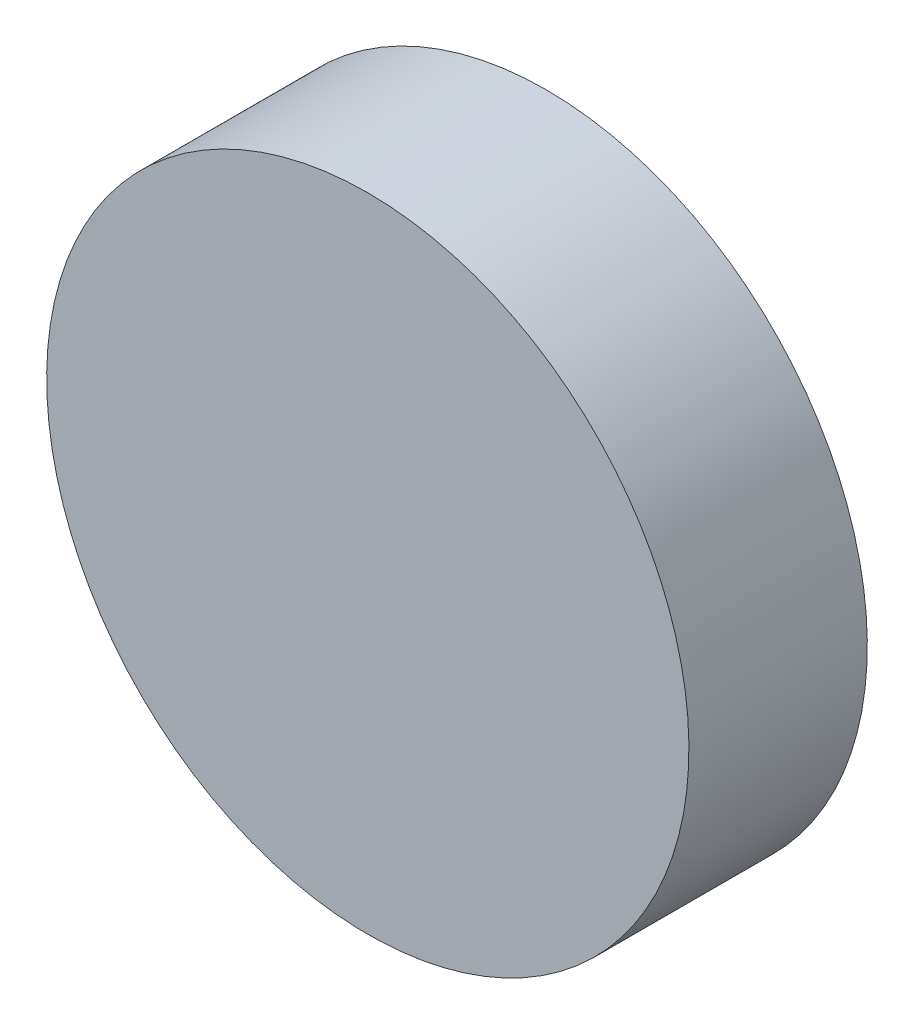
ISO-10303-21;
HEADER;
FILE_DESCRIPTION(('STEP AP214'),'2;1');
FILE_NAME('part.step','',(''),(''),'','','');
FILE_SCHEMA(('AUTOMOTIVE_DESIGN { 1 0 10303 214 1 1 1 1 }'));
ENDSEC;
DATA;
#1=APPLICATION_CONTEXT('core data for automotive mechanical design processes');
#2=APPLICATION_PROTOCOL_DEFINITION('international standard','automotive_design',2000,#1);
#3=PRODUCT_CONTEXT('',#1,'mechanical');
#4=PRODUCT('Part','Part','',(#3));
#5=PRODUCT_RELATED_PRODUCT_CATEGORY('part','',(#4));
#6=PRODUCT_DEFINITION_FORMATION('','',#4);
#7=PRODUCT_DEFINITION_CONTEXT('part definition',#1,'design');
#8=PRODUCT_DEFINITION('design','',#6,#7);
#9=PRODUCT_DEFINITION_SHAPE('','',#8);
#10=(LENGTH_UNIT() NAMED_UNIT(*) SI_UNIT(.MILLI.,.METRE.));
#11=(NAMED_UNIT(*) PLANE_ANGLE_UNIT() SI_UNIT($,.RADIAN.));
#12=(NAMED_UNIT(*) SI_UNIT($,.STERADIAN.) SOLID_ANGLE_UNIT());
#13=UNCERTAINTY_MEASURE_WITH_UNIT(LENGTH_MEASURE(1.E-05),#10,'distance_accuracy_value','');
#14=(GEOMETRIC_REPRESENTATION_CONTEXT(3) GLOBAL_UNCERTAINTY_ASSIGNED_CONTEXT((#13)) GLOBAL_UNIT_ASSIGNED_CONTEXT((#10,
#11,#12)) REPRESENTATION_CONTEXT('',''));
#15=CARTESIAN_POINT('',(0.,0.,0.));
#16=DIRECTION('',(0.,0.,1.));
#17=DIRECTION('',(1.,0.,0.));
#18=AXIS2_PLACEMENT_3D('',#15,#16,#17);
#19=CARTESIAN_POINT('',(23.8721990900897,21.3631677147825,-0.253998923289316));
#20=DIRECTION('',(0.,-8.74227339409095E-08,1.));
#21=DIRECTION('',(-1.19248806384999E-08,-1.,-8.74227339409095E-08));
#22=AXIS2_PLACEMENT_3D('',#19,#20,#21);
#23=PLANE('',#22);
#24=CARTESIAN_POINT('',(23.8721990846376,20.9059677147826,-0.253998963258991));
#25=DIRECTION('',(0.,8.74227339409095E-08,-1.));
#26=DIRECTION('',(1.19248806384999E-08,1.,8.74227339409095E-08));
#27=AXIS2_PLACEMENT_3D('',#24,#25,#26);
#28=CIRCLE('',#27,0.4572);
#29=CARTESIAN_POINT('',(23.8721990900897,21.3631677147826,-0.253998923289317));
#30=VERTEX_POINT('',#29);
#31=EDGE_CURVE('E10',#30,#30,#28,.T.);
#32=ORIENTED_EDGE('',*,*,#31,.T.);
#33=EDGE_LOOP('',(#32));
#34=FACE_BOUND('',#33,.T.);
#35=ADVANCED_FACE('F15',(#34),#23,.F.);
#36=CARTESIAN_POINT('',(23.8721990900897,21.3631676925772,1.07671068285201E-06));
#37=DIRECTION('',(0.,-8.74227339409095E-08,1.));
#38=DIRECTION('',(-1.19248806384999E-08,-1.,-8.74227339409095E-08));
#39=AXIS2_PLACEMENT_3D('',#36,#37,#38);
#40=PLANE('',#39);
#41=CARTESIAN_POINT('',(23.8721990846376,20.9059676925772,1.03674100901396E-06));
#42=DIRECTION('',(0.,8.74227339409095E-08,-1.));
#43=DIRECTION('',(1.19248806384999E-08,1.,8.74227339409095E-08));
#44=AXIS2_PLACEMENT_3D('',#41,#42,#43);
#45=CIRCLE('',#44,0.4572);
#46=CARTESIAN_POINT('',(23.8721990900897,21.3631676925772,1.07671068297175E-06));
#47=VERTEX_POINT('',#46);
#48=EDGE_CURVE('E22',#47,#47,#45,.T.);
#49=ORIENTED_EDGE('',*,*,#48,.F.);
#50=EDGE_LOOP('',(#49));
#51=FACE_BOUND('',#50,.T.);
#52=ADVANCED_FACE('F35',(#51),#40,.T.);
#53=CARTESIAN_POINT('',(23.8721990846376,20.9059676925772,1.03674100901396E-06));
#54=DIRECTION('',(0.,-8.74227339409095E-08,1.));
#55=DIRECTION('',(1.19248806384999E-08,1.,8.74227339409095E-08));
#56=AXIS2_PLACEMENT_3D('',#53,#54,#55);
#57=CYLINDRICAL_SURFACE('',#56,0.4572);
#58=ORIENTED_EDGE('',*,*,#31,.F.);
#59=EDGE_LOOP('',(#58));
#60=FACE_BOUND('',#59,.T.);
#61=ORIENTED_EDGE('',*,*,#48,.T.);
#62=EDGE_LOOP('',(#61));
#63=FACE_BOUND('',#62,.T.);
#64=ADVANCED_FACE('F33',(#60,#63),#57,.T.);
#65=CLOSED_SHELL('',(#35,#52,#64));
#66=MANIFOLD_SOLID_BREP('B1',#65);
#67=ADVANCED_BREP_SHAPE_REPRESENTATION('',(#18,#66),#14);
#68=SHAPE_DEFINITION_REPRESENTATION(#9,#67);
ENDSEC;
END-ISO-10303-21;
